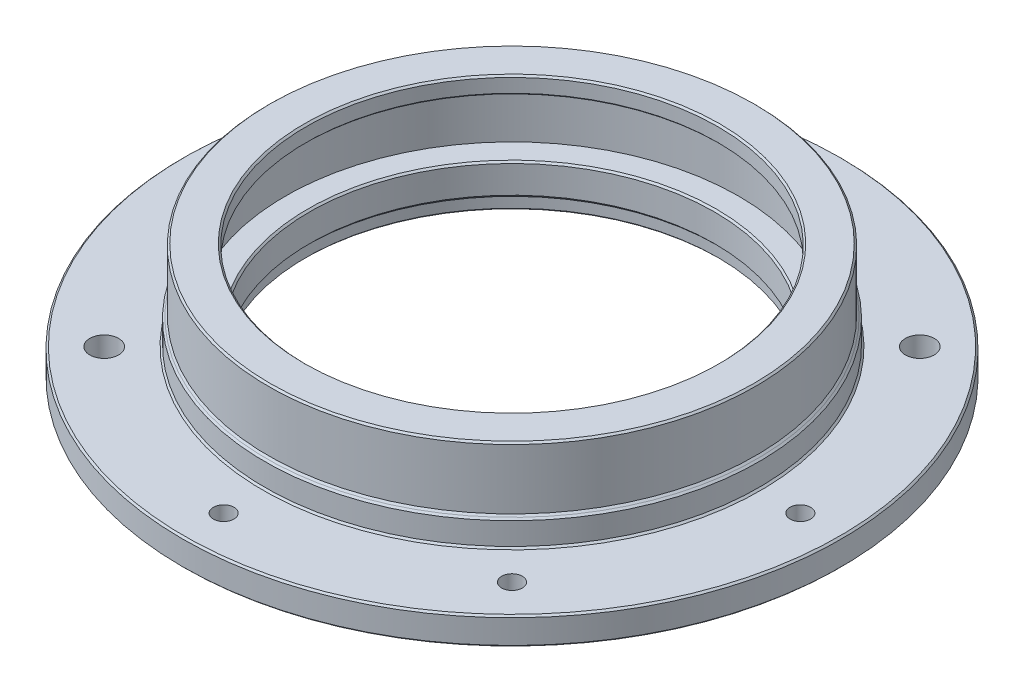
ISO-10303-21;
HEADER;
FILE_DESCRIPTION(('STEP AP214'),'2;1');
FILE_NAME('part.step','',(''),(''),'','','');
FILE_SCHEMA(('AUTOMOTIVE_DESIGN { 1 0 10303 214 1 1 1 1 }'));
ENDSEC;
DATA;
#1=APPLICATION_CONTEXT('core data for automotive mechanical design processes');
#2=APPLICATION_PROTOCOL_DEFINITION('international standard','automotive_design',2000,#1);
#3=PRODUCT_CONTEXT('',#1,'mechanical');
#4=PRODUCT('Part','Part','',(#3));
#5=PRODUCT_RELATED_PRODUCT_CATEGORY('part','',(#4));
#6=PRODUCT_DEFINITION_FORMATION('','',#4);
#7=PRODUCT_DEFINITION_CONTEXT('part definition',#1,'design');
#8=PRODUCT_DEFINITION('design','',#6,#7);
#9=PRODUCT_DEFINITION_SHAPE('','',#8);
#10=(LENGTH_UNIT() NAMED_UNIT(*) SI_UNIT(.MILLI.,.METRE.));
#11=(NAMED_UNIT(*) PLANE_ANGLE_UNIT() SI_UNIT($,.RADIAN.));
#12=(NAMED_UNIT(*) SI_UNIT($,.STERADIAN.) SOLID_ANGLE_UNIT());
#13=UNCERTAINTY_MEASURE_WITH_UNIT(LENGTH_MEASURE(1.E-05),#10,'distance_accuracy_value','');
#14=(GEOMETRIC_REPRESENTATION_CONTEXT(3) GLOBAL_UNCERTAINTY_ASSIGNED_CONTEXT((#13)) GLOBAL_UNIT_ASSIGNED_CONTEXT((#10,
#11,#12)) REPRESENTATION_CONTEXT('',''));
#15=CARTESIAN_POINT('',(0.,0.,0.));
#16=DIRECTION('',(0.,0.,1.));
#17=DIRECTION('',(1.,0.,0.));
#18=AXIS2_PLACEMENT_3D('',#15,#16,#17);
#19=CARTESIAN_POINT('',(-33.25,6.5,0.));
#20=DIRECTION('',(0.,-1.,0.));
#21=DIRECTION('',(0.,0.,-1.));
#22=AXIS2_PLACEMENT_3D('',#19,#20,#21);
#23=PLANE('',#22);
#24=CARTESIAN_POINT('',(0.,6.5,0.));
#25=DIRECTION('',(0.,-1.,0.));
#26=DIRECTION('',(0.,0.,-1.));
#27=AXIS2_PLACEMENT_3D('',#24,#25,#26);
#28=CIRCLE('',#27,29.75);
#29=CARTESIAN_POINT('',(0.,6.5,-29.75));
#30=VERTEX_POINT('',#29);
#31=EDGE_CURVE('E72',#30,#30,#28,.T.);
#32=ORIENTED_EDGE('',*,*,#31,.T.);
#33=EDGE_LOOP('',(#32));
#34=FACE_BOUND('',#33,.T.);
#35=CARTESIAN_POINT('',(0.,6.5,0.));
#36=DIRECTION('',(0.,-1.,0.));
#37=DIRECTION('',(0.,0.,-1.));
#38=AXIS2_PLACEMENT_3D('',#35,#36,#37);
#39=CIRCLE('',#38,33.);
#40=CARTESIAN_POINT('',(0.,6.5,-33.));
#41=VERTEX_POINT('',#40);
#42=EDGE_CURVE('E75',#41,#41,#39,.F.);
#43=ORIENTED_EDGE('',*,*,#42,.T.);
#44=EDGE_LOOP('',(#43));
#45=FACE_BOUND('',#44,.T.);
#46=ADVANCED_FACE('F51',(#34,#45),#23,.F.);
#47=CARTESIAN_POINT('',(0.,0.,0.));
#48=DIRECTION('',(0.,-1.,0.));
#49=DIRECTION('',(0.,0.,-1.));
#50=AXIS2_PLACEMENT_3D('',#47,#48,#49);
#51=CYLINDRICAL_SURFACE('',#50,29.5);
#52=CARTESIAN_POINT('',(0.,2.25000000000002,0.));
#53=DIRECTION('',(0.,1.,0.));
#54=DIRECTION('',(0.,0.,1.));
#55=AXIS2_PLACEMENT_3D('',#52,#53,#54);
#56=CIRCLE('',#55,29.5);
#57=CARTESIAN_POINT('',(0.,2.25000000000002,29.5));
#58=VERTEX_POINT('',#57);
#59=EDGE_CURVE('E78',#58,#58,#56,.F.);
#60=ORIENTED_EDGE('',*,*,#59,.T.);
#61=EDGE_LOOP('',(#60));
#62=FACE_BOUND('',#61,.T.);
#63=CARTESIAN_POINT('',(0.,6.25,0.));
#64=DIRECTION('',(0.,-1.,0.));
#65=DIRECTION('',(0.,0.,-1.));
#66=AXIS2_PLACEMENT_3D('',#63,#64,#65);
#67=CIRCLE('',#66,29.5);
#68=CARTESIAN_POINT('',(0.,6.25,-29.5));
#69=VERTEX_POINT('',#68);
#70=EDGE_CURVE('E81',#69,#69,#67,.F.);
#71=ORIENTED_EDGE('',*,*,#70,.T.);
#72=EDGE_LOOP('',(#71));
#73=FACE_BOUND('',#72,.T.);
#74=ADVANCED_FACE('F115',(#62,#73),#51,.F.);
#75=CARTESIAN_POINT('',(0.,0.,0.));
#76=DIRECTION('',(0.,-1.,0.));
#77=DIRECTION('',(0.,0.,-1.));
#78=AXIS2_PLACEMENT_3D('',#75,#76,#77);
#79=CYLINDRICAL_SURFACE('',#78,30.);
#80=CARTESIAN_POINT('',(0.,1.75000000000002,0.));
#81=DIRECTION('',(0.,1.,0.));
#82=DIRECTION('',(0.,0.,1.));
#83=AXIS2_PLACEMENT_3D('',#80,#81,#82);
#84=CIRCLE('',#83,30.);
#85=CARTESIAN_POINT('',(0.,1.75000000000002,30.));
#86=VERTEX_POINT('',#85);
#87=EDGE_CURVE('E84',#86,#86,#84,.T.);
#88=ORIENTED_EDGE('',*,*,#87,.T.);
#89=EDGE_LOOP('',(#88));
#90=FACE_BOUND('',#89,.T.);
#91=CARTESIAN_POINT('',(0.,0.249999999999983,0.));
#92=DIRECTION('',(0.,1.,0.));
#93=DIRECTION('',(0.,0.,1.));
#94=AXIS2_PLACEMENT_3D('',#91,#92,#93);
#95=CIRCLE('',#94,30.);
#96=CARTESIAN_POINT('',(0.,0.249999999999983,30.));
#97=VERTEX_POINT('',#96);
#98=EDGE_CURVE('E87',#97,#97,#95,.F.);
#99=ORIENTED_EDGE('',*,*,#98,.T.);
#100=EDGE_LOOP('',(#99));
#101=FACE_BOUND('',#100,.T.);
#102=ADVANCED_FACE('F121',(#90,#101),#79,.F.);
#103=CARTESIAN_POINT('',(-30.,0.,0.));
#104=DIRECTION('',(0.,1.,0.));
#105=DIRECTION('',(0.,0.,1.));
#106=AXIS2_PLACEMENT_3D('',#103,#104,#105);
#107=PLANE('',#106);
#108=CARTESIAN_POINT('',(0.,0.,0.));
#109=DIRECTION('',(0.,1.,0.));
#110=DIRECTION('',(0.,0.,1.));
#111=AXIS2_PLACEMENT_3D('',#108,#109,#110);
#112=CIRCLE('',#111,33.);
#113=CARTESIAN_POINT('',(0.,0.,33.));
#114=VERTEX_POINT('',#113);
#115=EDGE_CURVE('E11',#114,#114,#112,.F.);
#116=ORIENTED_EDGE('',*,*,#115,.T.);
#117=EDGE_LOOP('',(#116));
#118=FACE_BOUND('',#117,.T.);
#119=CARTESIAN_POINT('',(0.,0.,0.));
#120=DIRECTION('',(0.,1.,0.));
#121=DIRECTION('',(0.,0.,1.));
#122=AXIS2_PLACEMENT_3D('',#119,#120,#121);
#123=CIRCLE('',#122,30.25);
#124=CARTESIAN_POINT('',(0.,0.,30.25));
#125=VERTEX_POINT('',#124);
#126=EDGE_CURVE('E60',#125,#125,#123,.T.);
#127=ORIENTED_EDGE('',*,*,#126,.T.);
#128=EDGE_LOOP('',(#127));
#129=FACE_BOUND('',#128,.T.);
#130=ADVANCED_FACE('F108',(#118,#129),#107,.F.);
#131=CARTESIAN_POINT('',(0.,0.,0.));
#132=DIRECTION('',(0.,-1.,0.));
#133=DIRECTION('',(0.,0.,-1.));
#134=AXIS2_PLACEMENT_3D('',#131,#132,#133);
#135=CYLINDRICAL_SURFACE('',#134,33.25);
#136=CARTESIAN_POINT('',(0.,6.25,0.));
#137=DIRECTION('',(0.,-1.,0.));
#138=DIRECTION('',(0.,0.,-1.));
#139=AXIS2_PLACEMENT_3D('',#136,#137,#138);
#140=CIRCLE('',#139,33.25);
#141=CARTESIAN_POINT('',(0.,6.25,-33.25));
#142=VERTEX_POINT('',#141);
#143=EDGE_CURVE('E64',#142,#142,#140,.T.);
#144=ORIENTED_EDGE('',*,*,#143,.T.);
#145=EDGE_LOOP('',(#144));
#146=FACE_BOUND('',#145,.T.);
#147=CARTESIAN_POINT('',(0.,0.249999999999993,0.));
#148=DIRECTION('',(0.,1.,0.));
#149=DIRECTION('',(0.,0.,1.));
#150=AXIS2_PLACEMENT_3D('',#147,#148,#149);
#151=CIRCLE('',#150,33.25);
#152=CARTESIAN_POINT('',(0.,0.249999999999993,33.25));
#153=VERTEX_POINT('',#152);
#154=EDGE_CURVE('E69',#153,#153,#151,.T.);
#155=ORIENTED_EDGE('',*,*,#154,.T.);
#156=EDGE_LOOP('',(#155));
#157=FACE_BOUND('',#156,.T.);
#158=ADVANCED_FACE('F98',(#146,#157),#135,.T.);
#159=CARTESIAN_POINT('',(0.,2.25000000000002,0.));
#160=DIRECTION('',(0.,-1.,0.));
#161=DIRECTION('',(0.,0.,-1.));
#162=AXIS2_PLACEMENT_3D('',#159,#160,#161);
#163=CONICAL_SURFACE('',#162,29.5,0.785398163397435);
#164=ORIENTED_EDGE('',*,*,#59,.F.);
#165=EDGE_LOOP('',(#164));
#166=FACE_BOUND('',#165,.T.);
#167=CARTESIAN_POINT('',(0.,2.,0.));
#168=DIRECTION('',(0.,1.,0.));
#169=DIRECTION('',(0.,0.,1.));
#170=AXIS2_PLACEMENT_3D('',#167,#168,#169);
#171=CIRCLE('',#170,29.75);
#172=CARTESIAN_POINT('',(0.,2.,29.75));
#173=VERTEX_POINT('',#172);
#174=EDGE_CURVE('E56',#173,#173,#171,.T.);
#175=ORIENTED_EDGE('',*,*,#174,.F.);
#176=EDGE_LOOP('',(#175));
#177=FACE_BOUND('',#176,.T.);
#178=ADVANCED_FACE('F96',(#166,#177),#163,.F.);
#179=CARTESIAN_POINT('',(0.,2.,0.));
#180=DIRECTION('',(0.,-1.,0.));
#181=DIRECTION('',(0.,0.,-1.));
#182=AXIS2_PLACEMENT_3D('',#179,#180,#181);
#183=CONICAL_SURFACE('',#182,29.75,0.785398163397434);
#184=ORIENTED_EDGE('',*,*,#87,.F.);
#185=EDGE_LOOP('',(#184));
#186=FACE_BOUND('',#185,.T.);
#187=ORIENTED_EDGE('',*,*,#174,.T.);
#188=EDGE_LOOP('',(#187));
#189=FACE_BOUND('',#188,.T.);
#190=ADVANCED_FACE('F94',(#186,#189),#183,.F.);
#191=CARTESIAN_POINT('',(0.,6.5,0.));
#192=DIRECTION('',(0.,1.,0.));
#193=DIRECTION('',(0.,0.,1.));
#194=AXIS2_PLACEMENT_3D('',#191,#192,#193);
#195=CONICAL_SURFACE('',#194,29.75,0.785398163397448);
#196=ORIENTED_EDGE('',*,*,#70,.F.);
#197=EDGE_LOOP('',(#196));
#198=FACE_BOUND('',#197,.T.);
#199=ORIENTED_EDGE('',*,*,#31,.F.);
#200=EDGE_LOOP('',(#199));
#201=FACE_BOUND('',#200,.T.);
#202=ADVANCED_FACE('F105',(#198,#201),#195,.F.);
#203=CARTESIAN_POINT('',(0.,6.25,0.));
#204=DIRECTION('',(0.,-1.,0.));
#205=DIRECTION('',(0.,0.,-1.));
#206=AXIS2_PLACEMENT_3D('',#203,#204,#205);
#207=CONICAL_SURFACE('',#206,33.25,0.785398163397448);
#208=ORIENTED_EDGE('',*,*,#42,.F.);
#209=EDGE_LOOP('',(#208));
#210=FACE_BOUND('',#209,.T.);
#211=ORIENTED_EDGE('',*,*,#143,.F.);
#212=EDGE_LOOP('',(#211));
#213=FACE_BOUND('',#212,.T.);
#214=ADVANCED_FACE('F139',(#210,#213),#207,.T.);
#215=CARTESIAN_POINT('',(0.,0.,0.));
#216=DIRECTION('',(0.,1.,0.));
#217=DIRECTION('',(0.,0.,1.));
#218=AXIS2_PLACEMENT_3D('',#215,#216,#217);
#219=CONICAL_SURFACE('',#218,33.,0.785398163397462);
#220=ORIENTED_EDGE('',*,*,#154,.F.);
#221=EDGE_LOOP('',(#220));
#222=FACE_BOUND('',#221,.T.);
#223=ORIENTED_EDGE('',*,*,#115,.F.);
#224=EDGE_LOOP('',(#223));
#225=FACE_BOUND('',#224,.T.);
#226=ADVANCED_FACE('F142',(#222,#225),#219,.T.);
#227=CARTESIAN_POINT('',(0.,0.249999999999983,0.));
#228=DIRECTION('',(0.,-1.,0.));
#229=DIRECTION('',(0.,0.,-1.));
#230=AXIS2_PLACEMENT_3D('',#227,#228,#229);
#231=CONICAL_SURFACE('',#230,30.,0.785398163397434);
#232=ORIENTED_EDGE('',*,*,#126,.F.);
#233=EDGE_LOOP('',(#232));
#234=FACE_BOUND('',#233,.T.);
#235=ORIENTED_EDGE('',*,*,#98,.F.);
#236=EDGE_LOOP('',(#235));
#237=FACE_BOUND('',#236,.T.);
#238=ADVANCED_FACE('F54',(#234,#237),#231,.F.);
#239=CLOSED_SHELL('',(#46,#74,#102,#130,#158,#178,#190,#202,#214,#226,#238));
#240=MANIFOLD_SOLID_BREP('B2',#239);
#241=CARTESIAN_POINT('',(0.,0.,0.));
#242=DIRECTION('',(0.,-1.,0.));
#243=DIRECTION('',(0.,0.,-1.));
#244=AXIS2_PLACEMENT_3D('',#241,#242,#243);
#245=CYLINDRICAL_SURFACE('',#244,48.);
#246=CARTESIAN_POINT('',(0.,3.74999999999999,0.));
#247=DIRECTION('',(0.,-1.,0.));
#248=DIRECTION('',(0.,0.,-1.));
#249=AXIS2_PLACEMENT_3D('',#246,#247,#248);
#250=CIRCLE('',#249,48.);
#251=CARTESIAN_POINT('',(0.,3.74999999999999,-48.));
#252=VERTEX_POINT('',#251);
#253=EDGE_CURVE('E232',#252,#252,#250,.T.);
#254=ORIENTED_EDGE('',*,*,#253,.T.);
#255=EDGE_LOOP('',(#254));
#256=FACE_BOUND('',#255,.T.);
#257=CARTESIAN_POINT('',(0.,0.249999999999966,0.));
#258=DIRECTION('',(0.,1.,0.));
#259=DIRECTION('',(0.,0.,1.));
#260=AXIS2_PLACEMENT_3D('',#257,#258,#259);
#261=CIRCLE('',#260,48.);
#262=CARTESIAN_POINT('',(0.,0.249999999999966,48.));
#263=VERTEX_POINT('',#262);
#264=EDGE_CURVE('E235',#263,#263,#261,.T.);
#265=ORIENTED_EDGE('',*,*,#264,.T.);
#266=EDGE_LOOP('',(#265));
#267=FACE_BOUND('',#266,.T.);
#268=ADVANCED_FACE('F214',(#256,#267),#245,.T.);
#269=CARTESIAN_POINT('',(-48.,0.,0.));
#270=DIRECTION('',(0.,1.,0.));
#271=DIRECTION('',(0.,0.,1.));
#272=AXIS2_PLACEMENT_3D('',#269,#270,#271);
#273=PLANE('',#272);
#274=CARTESIAN_POINT('',(0.,0.,0.));
#275=DIRECTION('',(0.,1.,0.));
#276=DIRECTION('',(0.,0.,1.));
#277=AXIS2_PLACEMENT_3D('',#274,#275,#276);
#278=CIRCLE('',#277,47.75);
#279=CARTESIAN_POINT('',(0.,0.,47.75));
#280=VERTEX_POINT('',#279);
#281=EDGE_CURVE('E223',#280,#280,#278,.F.);
#282=ORIENTED_EDGE('',*,*,#281,.T.);
#283=EDGE_LOOP('',(#282));
#284=FACE_BOUND('',#283,.T.);
#285=CARTESIAN_POINT('',(0.,0.,0.));
#286=DIRECTION('',(0.,1.,0.));
#287=DIRECTION('',(0.,0.,1.));
#288=AXIS2_PLACEMENT_3D('',#285,#286,#287);
#289=CIRCLE('',#288,33.5);
#290=CARTESIAN_POINT('',(0.,0.,33.5));
#291=VERTEX_POINT('',#290);
#292=EDGE_CURVE('E227',#291,#291,#289,.T.);
#293=ORIENTED_EDGE('',*,*,#292,.T.);
#294=EDGE_LOOP('',(#293));
#295=FACE_BOUND('',#294,.T.);
#296=CARTESIAN_POINT('',(-42.,0.,0.));
#297=DIRECTION('',(0.,1.,0.));
#298=DIRECTION('',(0.,0.,1.));
#299=AXIS2_PLACEMENT_3D('',#296,#297,#298);
#300=CIRCLE('',#299,1.5);
#301=CARTESIAN_POINT('',(-42.,0.,1.5));
#302=VERTEX_POINT('',#301);
#303=EDGE_CURVE('E280',#302,#302,#300,.T.);
#304=ORIENTED_EDGE('',*,*,#303,.T.);
#305=EDGE_LOOP('',(#304));
#306=FACE_BOUND('',#305,.T.);
#307=CARTESIAN_POINT('',(0.,0.,42.));
#308=DIRECTION('',(0.,1.,0.));
#309=DIRECTION('',(0.,0.,1.));
#310=AXIS2_PLACEMENT_3D('',#307,#308,#309);
#311=CIRCLE('',#310,1.5);
#312=CARTESIAN_POINT('',(0.,0.,43.5));
#313=VERTEX_POINT('',#312);
#314=EDGE_CURVE('E310',#313,#313,#311,.T.);
#315=ORIENTED_EDGE('',*,*,#314,.T.);
#316=EDGE_LOOP('',(#315));
#317=FACE_BOUND('',#316,.T.);
#318=CARTESIAN_POINT('',(29.6984848098347,0.,29.6984848098353));
#319=DIRECTION('',(0.,1.,0.));
#320=DIRECTION('',(0.,0.,1.));
#321=AXIS2_PLACEMENT_3D('',#318,#319,#320);
#322=CIRCLE('',#321,1.5);
#323=CARTESIAN_POINT('',(29.6984848098347,0.,31.1984848098353));
#324=VERTEX_POINT('',#323);
#325=EDGE_CURVE('E316',#324,#324,#322,.T.);
#326=ORIENTED_EDGE('',*,*,#325,.T.);
#327=EDGE_LOOP('',(#326));
#328=FACE_BOUND('',#327,.T.);
#329=CARTESIAN_POINT('',(42.,0.,2.93284432462823E-13));
#330=DIRECTION('',(0.,1.,0.));
#331=DIRECTION('',(0.,0.,1.));
#332=AXIS2_PLACEMENT_3D('',#329,#330,#331);
#333=CIRCLE('',#332,1.5);
#334=CARTESIAN_POINT('',(42.,0.,1.5000000000003));
#335=VERTEX_POINT('',#334);
#336=EDGE_CURVE('E285',#335,#335,#333,.T.);
#337=ORIENTED_EDGE('',*,*,#336,.T.);
#338=EDGE_LOOP('',(#337));
#339=FACE_BOUND('',#338,.T.);
#340=CARTESIAN_POINT('',(29.6984848098351,0.,-29.6984848098344));
#341=DIRECTION('',(0.,1.,0.));
#342=DIRECTION('',(0.,0.,-1.));
#343=AXIS2_PLACEMENT_3D('',#340,#341,#342);
#344=CIRCLE('',#343,2.09999999999999);
#345=CARTESIAN_POINT('',(29.6984848098351,0.,-31.7984848098344));
#346=VERTEX_POINT('',#345);
#347=EDGE_CURVE('E284',#346,#346,#344,.T.);
#348=ORIENTED_EDGE('',*,*,#347,.T.);
#349=EDGE_LOOP('',(#348));
#350=FACE_BOUND('',#349,.T.);
#351=CARTESIAN_POINT('',(1.46642216231412E-13,0.,-42.));
#352=DIRECTION('',(0.,1.,0.));
#353=DIRECTION('',(0.,0.,1.));
#354=AXIS2_PLACEMENT_3D('',#351,#352,#353);
#355=CIRCLE('',#354,1.5);
#356=CARTESIAN_POINT('',(1.46642216231412E-13,0.,-40.5));
#357=VERTEX_POINT('',#356);
#358=EDGE_CURVE('E291',#357,#357,#355,.T.);
#359=ORIENTED_EDGE('',*,*,#358,.T.);
#360=EDGE_LOOP('',(#359));
#361=FACE_BOUND('',#360,.T.);
#362=CARTESIAN_POINT('',(-29.698484809835,0.,-29.6984848098351));
#363=DIRECTION('',(0.,1.,0.));
#364=DIRECTION('',(0.,0.,1.));
#365=AXIS2_PLACEMENT_3D('',#362,#363,#364);
#366=CIRCLE('',#365,1.5);
#367=CARTESIAN_POINT('',(-29.698484809835,0.,-28.198484809835));
#368=VERTEX_POINT('',#367);
#369=EDGE_CURVE('E297',#368,#368,#366,.T.);
#370=ORIENTED_EDGE('',*,*,#369,.T.);
#371=EDGE_LOOP('',(#370));
#372=FACE_BOUND('',#371,.T.);
#373=CARTESIAN_POINT('',(-29.6984848098346,0.,29.6984848098354));
#374=DIRECTION('',(0.,1.,0.));
#375=DIRECTION('',(0.,0.,1.));
#376=AXIS2_PLACEMENT_3D('',#373,#374,#375);
#377=CIRCLE('',#376,2.0999999999998);
#378=CARTESIAN_POINT('',(-29.6984848098346,0.,31.7984848098352));
#379=VERTEX_POINT('',#378);
#380=EDGE_CURVE('E303',#379,#379,#377,.T.);
#381=ORIENTED_EDGE('',*,*,#380,.T.);
#382=EDGE_LOOP('',(#381));
#383=FACE_BOUND('',#382,.T.);
#384=ADVANCED_FACE('F329',(#284,#295,#306,#317,#328,#339,#350,#361,#372,#383),#273,.F.);
#385=CARTESIAN_POINT('',(0.,0.,0.));
#386=DIRECTION('',(0.,-1.,0.));
#387=DIRECTION('',(0.,0.,-1.));
#388=AXIS2_PLACEMENT_3D('',#385,#386,#387);
#389=CYLINDRICAL_SURFACE('',#388,33.25);
#390=CARTESIAN_POINT('',(0.,0.249999999999993,0.));
#391=DIRECTION('',(0.,1.,0.));
#392=DIRECTION('',(0.,0.,1.));
#393=AXIS2_PLACEMENT_3D('',#390,#391,#392);
#394=CIRCLE('',#393,33.25);
#395=CARTESIAN_POINT('',(0.,0.249999999999993,33.25));
#396=VERTEX_POINT('',#395);
#397=EDGE_CURVE('E50',#396,#396,#394,.F.);
#398=ORIENTED_EDGE('',*,*,#397,.T.);
#399=EDGE_LOOP('',(#398));
#400=FACE_BOUND('',#399,.T.);
#401=CARTESIAN_POINT('',(0.,6.5,0.));
#402=DIRECTION('',(0.,-1.,0.));
#403=DIRECTION('',(0.,0.,-1.));
#404=AXIS2_PLACEMENT_3D('',#401,#402,#403);
#405=CIRCLE('',#404,33.25);
#406=CARTESIAN_POINT('',(0.,6.5,-33.25));
#407=VERTEX_POINT('',#406);
#408=EDGE_CURVE('E271',#407,#407,#405,.T.);
#409=ORIENTED_EDGE('',*,*,#408,.F.);
#410=EDGE_LOOP('',(#409));
#411=FACE_BOUND('',#410,.T.);
#412=ADVANCED_FACE('F382',(#400,#411),#389,.F.);
#413=CARTESIAN_POINT('',(-33.25,6.5,0.));
#414=DIRECTION('',(0.,1.,0.));
#415=DIRECTION('',(0.,0.,1.));
#416=AXIS2_PLACEMENT_3D('',#413,#414,#415);
#417=PLANE('',#416);
#418=CARTESIAN_POINT('',(0.,6.5,0.));
#419=DIRECTION('',(0.,-1.,0.));
#420=DIRECTION('',(0.,0.,-1.));
#421=AXIS2_PLACEMENT_3D('',#418,#419,#420);
#422=CIRCLE('',#421,33.);
#423=CARTESIAN_POINT('',(0.,6.5,-33.));
#424=VERTEX_POINT('',#423);
#425=EDGE_CURVE('E274',#424,#424,#422,.T.);
#426=ORIENTED_EDGE('',*,*,#425,.F.);
#427=EDGE_LOOP('',(#426));
#428=FACE_BOUND('',#427,.T.);
#429=ORIENTED_EDGE('',*,*,#408,.T.);
#430=EDGE_LOOP('',(#429));
#431=FACE_BOUND('',#430,.T.);
#432=ADVANCED_FACE('F593',(#428,#431),#417,.F.);
#433=CARTESIAN_POINT('',(0.,0.,0.));
#434=DIRECTION('',(0.,-1.,0.));
#435=DIRECTION('',(0.,0.,-1.));
#436=AXIS2_PLACEMENT_3D('',#433,#434,#435);
#437=CYLINDRICAL_SURFACE('',#436,33.);
#438=CARTESIAN_POINT('',(0.,14.5,0.));
#439=DIRECTION('',(0.,-1.,0.));
#440=DIRECTION('',(0.,0.,-1.));
#441=AXIS2_PLACEMENT_3D('',#438,#439,#440);
#442=CIRCLE('',#441,33.);
#443=CARTESIAN_POINT('',(0.,14.5,-33.));
#444=VERTEX_POINT('',#443);
#445=EDGE_CURVE('E277',#444,#444,#442,.T.);
#446=ORIENTED_EDGE('',*,*,#445,.F.);
#447=EDGE_LOOP('',(#446));
#448=FACE_BOUND('',#447,.T.);
#449=ORIENTED_EDGE('',*,*,#425,.T.);
#450=EDGE_LOOP('',(#449));
#451=FACE_BOUND('',#450,.T.);
#452=ADVANCED_FACE('F585',(#448,#451),#437,.F.);
#453=CARTESIAN_POINT('',(-33.,14.5,0.));
#454=DIRECTION('',(0.,1.,0.));
#455=DIRECTION('',(0.,0.,1.));
#456=AXIS2_PLACEMENT_3D('',#453,#454,#455);
#457=PLANE('',#456);
#458=CARTESIAN_POINT('',(0.,14.5,0.));
#459=DIRECTION('',(0.,1.,0.));
#460=DIRECTION('',(0.,0.,1.));
#461=AXIS2_PLACEMENT_3D('',#458,#459,#460);
#462=CIRCLE('',#461,30.25);
#463=CARTESIAN_POINT('',(0.,14.5,30.25));
#464=VERTEX_POINT('',#463);
#465=EDGE_CURVE('E250',#464,#464,#462,.T.);
#466=ORIENTED_EDGE('',*,*,#465,.T.);
#467=EDGE_LOOP('',(#466));
#468=FACE_BOUND('',#467,.T.);
#469=ORIENTED_EDGE('',*,*,#445,.T.);
#470=EDGE_LOOP('',(#469));
#471=FACE_BOUND('',#470,.T.);
#472=ADVANCED_FACE('F577',(#468,#471),#457,.F.);
#473=CARTESIAN_POINT('',(0.,0.,0.));
#474=DIRECTION('',(0.,-1.,0.));
#475=DIRECTION('',(0.,0.,-1.));
#476=AXIS2_PLACEMENT_3D('',#473,#474,#475);
#477=CYLINDRICAL_SURFACE('',#476,30.);
#478=CARTESIAN_POINT('',(0.,14.75,0.));
#479=DIRECTION('',(0.,1.,0.));
#480=DIRECTION('',(0.,0.,1.));
#481=AXIS2_PLACEMENT_3D('',#478,#479,#480);
#482=CIRCLE('',#481,30.);
#483=CARTESIAN_POINT('',(0.,14.75,30.));
#484=VERTEX_POINT('',#483);
#485=EDGE_CURVE('E253',#484,#484,#482,.F.);
#486=ORIENTED_EDGE('',*,*,#485,.T.);
#487=EDGE_LOOP('',(#486));
#488=FACE_BOUND('',#487,.T.);
#489=CARTESIAN_POINT('',(0.,16.75,0.));
#490=DIRECTION('',(0.,-1.,0.));
#491=DIRECTION('',(0.,0.,-1.));
#492=AXIS2_PLACEMENT_3D('',#489,#490,#491);
#493=CIRCLE('',#492,30.);
#494=CARTESIAN_POINT('',(0.,16.75,-30.));
#495=VERTEX_POINT('',#494);
#496=EDGE_CURVE('E256',#495,#495,#493,.F.);
#497=ORIENTED_EDGE('',*,*,#496,.T.);
#498=EDGE_LOOP('',(#497));
#499=FACE_BOUND('',#498,.T.);
#500=ADVANCED_FACE('F569',(#488,#499),#477,.F.);
#501=CARTESIAN_POINT('',(-30.,17.,0.));
#502=DIRECTION('',(0.,-1.,0.));
#503=DIRECTION('',(0.,0.,-1.));
#504=AXIS2_PLACEMENT_3D('',#501,#502,#503);
#505=PLANE('',#504);
#506=CARTESIAN_POINT('',(0.,17.,0.));
#507=DIRECTION('',(0.,-1.,0.));
#508=DIRECTION('',(0.,0.,-1.));
#509=AXIS2_PLACEMENT_3D('',#506,#507,#508);
#510=CIRCLE('',#509,35.25);
#511=CARTESIAN_POINT('',(0.,17.,-35.25));
#512=VERTEX_POINT('',#511);
#513=EDGE_CURVE('E259',#512,#512,#510,.F.);
#514=ORIENTED_EDGE('',*,*,#513,.T.);
#515=EDGE_LOOP('',(#514));
#516=FACE_BOUND('',#515,.T.);
#517=CARTESIAN_POINT('',(0.,17.,0.));
#518=DIRECTION('',(0.,-1.,0.));
#519=DIRECTION('',(0.,0.,-1.));
#520=AXIS2_PLACEMENT_3D('',#517,#518,#519);
#521=CIRCLE('',#520,30.25);
#522=CARTESIAN_POINT('',(0.,17.,-30.25));
#523=VERTEX_POINT('',#522);
#524=EDGE_CURVE('E262',#523,#523,#521,.T.);
#525=ORIENTED_EDGE('',*,*,#524,.T.);
#526=EDGE_LOOP('',(#525));
#527=FACE_BOUND('',#526,.T.);
#528=ADVANCED_FACE('F561',(#516,#527),#505,.F.);
#529=CARTESIAN_POINT('',(0.,0.,0.));
#530=DIRECTION('',(0.,-1.,0.));
#531=DIRECTION('',(0.,0.,-1.));
#532=AXIS2_PLACEMENT_3D('',#529,#530,#531);
#533=CYLINDRICAL_SURFACE('',#532,35.5);
#534=CARTESIAN_POINT('',(0.,16.75,0.));
#535=DIRECTION('',(0.,-1.,0.));
#536=DIRECTION('',(0.,0.,-1.));
#537=AXIS2_PLACEMENT_3D('',#534,#535,#536);
#538=CIRCLE('',#537,35.5);
#539=CARTESIAN_POINT('',(0.,16.75,-35.5));
#540=VERTEX_POINT('',#539);
#541=EDGE_CURVE('E265',#540,#540,#538,.T.);
#542=ORIENTED_EDGE('',*,*,#541,.T.);
#543=EDGE_LOOP('',(#542));
#544=FACE_BOUND('',#543,.T.);
#545=CARTESIAN_POINT('',(0.,8.,0.));
#546=DIRECTION('',(0.,-1.,0.));
#547=DIRECTION('',(0.,0.,-1.));
#548=AXIS2_PLACEMENT_3D('',#545,#546,#547);
#549=CIRCLE('',#548,35.5);
#550=CARTESIAN_POINT('',(0.,8.,-35.5));
#551=VERTEX_POINT('',#550);
#552=EDGE_CURVE('E268',#551,#551,#549,.F.);
#553=ORIENTED_EDGE('',*,*,#552,.T.);
#554=EDGE_LOOP('',(#553));
#555=FACE_BOUND('',#554,.T.);
#556=ADVANCED_FACE('F553',(#544,#555),#533,.T.);
#557=CARTESIAN_POINT('',(0.,0.,0.));
#558=DIRECTION('',(0.,-1.,0.));
#559=DIRECTION('',(0.,0.,-1.));
#560=AXIS2_PLACEMENT_3D('',#557,#558,#559);
#561=CYLINDRICAL_SURFACE('',#560,36.);
#562=CARTESIAN_POINT('',(0.,7.49999999999997,0.));
#563=DIRECTION('',(0.,-1.,0.));
#564=DIRECTION('',(0.,0.,-1.));
#565=AXIS2_PLACEMENT_3D('',#562,#563,#564);
#566=CIRCLE('',#565,36.);
#567=CARTESIAN_POINT('',(0.,7.49999999999997,-36.));
#568=VERTEX_POINT('',#567);
#569=EDGE_CURVE('E244',#568,#568,#566,.T.);
#570=ORIENTED_EDGE('',*,*,#569,.T.);
#571=EDGE_LOOP('',(#570));
#572=FACE_BOUND('',#571,.T.);
#573=CARTESIAN_POINT('',(0.,4.24999999999998,0.));
#574=DIRECTION('',(0.,-1.,0.));
#575=DIRECTION('',(0.,0.,-1.));
#576=AXIS2_PLACEMENT_3D('',#573,#574,#575);
#577=CIRCLE('',#576,36.);
#578=CARTESIAN_POINT('',(0.,4.24999999999998,-36.));
#579=VERTEX_POINT('',#578);
#580=EDGE_CURVE('E247',#579,#579,#577,.F.);
#581=ORIENTED_EDGE('',*,*,#580,.T.);
#582=EDGE_LOOP('',(#581));
#583=FACE_BOUND('',#582,.T.);
#584=ADVANCED_FACE('F344',(#572,#583),#561,.T.);
#585=CARTESIAN_POINT('',(-36.,4.,0.));
#586=DIRECTION('',(0.,-1.,0.));
#587=DIRECTION('',(0.,0.,-1.));
#588=AXIS2_PLACEMENT_3D('',#585,#586,#587);
#589=PLANE('',#588);
#590=CARTESIAN_POINT('',(0.,4.,0.));
#591=DIRECTION('',(0.,-1.,0.));
#592=DIRECTION('',(0.,0.,-1.));
#593=AXIS2_PLACEMENT_3D('',#590,#591,#592);
#594=CIRCLE('',#593,36.25);
#595=CARTESIAN_POINT('',(0.,4.,-36.25));
#596=VERTEX_POINT('',#595);
#597=EDGE_CURVE('E238',#596,#596,#594,.T.);
#598=ORIENTED_EDGE('',*,*,#597,.T.);
#599=EDGE_LOOP('',(#598));
#600=FACE_BOUND('',#599,.T.);
#601=CARTESIAN_POINT('',(0.,4.,0.));
#602=DIRECTION('',(0.,-1.,0.));
#603=DIRECTION('',(0.,0.,-1.));
#604=AXIS2_PLACEMENT_3D('',#601,#602,#603);
#605=CIRCLE('',#604,47.75);
#606=CARTESIAN_POINT('',(0.,4.,-47.75));
#607=VERTEX_POINT('',#606);
#608=EDGE_CURVE('E241',#607,#607,#605,.F.);
#609=ORIENTED_EDGE('',*,*,#608,.T.);
#610=EDGE_LOOP('',(#609));
#611=FACE_BOUND('',#610,.T.);
#612=CARTESIAN_POINT('',(-42.,4.,0.));
#613=DIRECTION('',(0.,1.,0.));
#614=DIRECTION('',(0.,0.,1.));
#615=AXIS2_PLACEMENT_3D('',#612,#613,#614);
#616=CIRCLE('',#615,1.5);
#617=CARTESIAN_POINT('',(-42.,4.,1.5));
#618=VERTEX_POINT('',#617);
#619=EDGE_CURVE('E306',#618,#618,#616,.T.);
#620=ORIENTED_EDGE('',*,*,#619,.F.);
#621=EDGE_LOOP('',(#620));
#622=FACE_BOUND('',#621,.T.);
#623=CARTESIAN_POINT('',(0.,4.,42.));
#624=DIRECTION('',(0.,1.,0.));
#625=DIRECTION('',(0.,0.,1.));
#626=AXIS2_PLACEMENT_3D('',#623,#624,#625);
#627=CIRCLE('',#626,1.5);
#628=CARTESIAN_POINT('',(0.,4.,43.5));
#629=VERTEX_POINT('',#628);
#630=EDGE_CURVE('E307',#629,#629,#627,.T.);
#631=ORIENTED_EDGE('',*,*,#630,.F.);
#632=EDGE_LOOP('',(#631));
#633=FACE_BOUND('',#632,.T.);
#634=CARTESIAN_POINT('',(29.6984848098347,4.,29.6984848098353));
#635=DIRECTION('',(0.,1.,0.));
#636=DIRECTION('',(0.,0.,1.));
#637=AXIS2_PLACEMENT_3D('',#634,#635,#636);
#638=CIRCLE('',#637,1.5);
#639=CARTESIAN_POINT('',(29.6984848098347,4.,31.1984848098353));
#640=VERTEX_POINT('',#639);
#641=EDGE_CURVE('E313',#640,#640,#638,.T.);
#642=ORIENTED_EDGE('',*,*,#641,.F.);
#643=EDGE_LOOP('',(#642));
#644=FACE_BOUND('',#643,.T.);
#645=CARTESIAN_POINT('',(42.,4.,2.93284432462823E-13));
#646=DIRECTION('',(0.,1.,0.));
#647=DIRECTION('',(0.,0.,1.));
#648=AXIS2_PLACEMENT_3D('',#645,#646,#647);
#649=CIRCLE('',#648,1.5);
#650=CARTESIAN_POINT('',(42.,4.,1.5000000000003));
#651=VERTEX_POINT('',#650);
#652=EDGE_CURVE('E319',#651,#651,#649,.T.);
#653=ORIENTED_EDGE('',*,*,#652,.F.);
#654=EDGE_LOOP('',(#653));
#655=FACE_BOUND('',#654,.T.);
#656=CARTESIAN_POINT('',(29.6984848098351,4.,-29.6984848098344));
#657=DIRECTION('',(0.,1.,0.));
#658=DIRECTION('',(0.,0.,-1.));
#659=AXIS2_PLACEMENT_3D('',#656,#657,#658);
#660=CIRCLE('',#659,2.09999999999999);
#661=CARTESIAN_POINT('',(29.6984848098351,4.,-31.7984848098344));
#662=VERTEX_POINT('',#661);
#663=EDGE_CURVE('E281',#662,#662,#660,.T.);
#664=ORIENTED_EDGE('',*,*,#663,.F.);
#665=EDGE_LOOP('',(#664));
#666=FACE_BOUND('',#665,.T.);
#667=CARTESIAN_POINT('',(1.46642216231412E-13,4.,-42.));
#668=DIRECTION('',(0.,1.,0.));
#669=DIRECTION('',(0.,0.,1.));
#670=AXIS2_PLACEMENT_3D('',#667,#668,#669);
#671=CIRCLE('',#670,1.5);
#672=CARTESIAN_POINT('',(1.46642216231412E-13,4.,-40.5));
#673=VERTEX_POINT('',#672);
#674=EDGE_CURVE('E288',#673,#673,#671,.T.);
#675=ORIENTED_EDGE('',*,*,#674,.F.);
#676=EDGE_LOOP('',(#675));
#677=FACE_BOUND('',#676,.T.);
#678=CARTESIAN_POINT('',(-29.698484809835,4.,-29.6984848098351));
#679=DIRECTION('',(0.,1.,0.));
#680=DIRECTION('',(0.,0.,1.));
#681=AXIS2_PLACEMENT_3D('',#678,#679,#680);
#682=CIRCLE('',#681,1.5);
#683=CARTESIAN_POINT('',(-29.698484809835,4.,-28.198484809835));
#684=VERTEX_POINT('',#683);
#685=EDGE_CURVE('E294',#684,#684,#682,.T.);
#686=ORIENTED_EDGE('',*,*,#685,.F.);
#687=EDGE_LOOP('',(#686));
#688=FACE_BOUND('',#687,.T.);
#689=CARTESIAN_POINT('',(-29.6984848098346,4.,29.6984848098354));
#690=DIRECTION('',(0.,1.,0.));
#691=DIRECTION('',(0.,0.,1.));
#692=AXIS2_PLACEMENT_3D('',#689,#690,#691);
#693=CIRCLE('',#692,2.0999999999998);
#694=CARTESIAN_POINT('',(-29.6984848098346,4.,31.7984848098352));
#695=VERTEX_POINT('',#694);
#696=EDGE_CURVE('E300',#695,#695,#693,.T.);
#697=ORIENTED_EDGE('',*,*,#696,.F.);
#698=EDGE_LOOP('',(#697));
#699=FACE_BOUND('',#698,.T.);
#700=ADVANCED_FACE('F340',(#600,#611,#622,#633,#644,#655,#666,#677,#688,#699),#589,.F.);
#701=CARTESIAN_POINT('',(-29.6984848098346,0.,29.6984848098354));
#702=DIRECTION('',(0.,1.,0.));
#703=DIRECTION('',(0.,0.,1.));
#704=AXIS2_PLACEMENT_3D('',#701,#702,#703);
#705=CYLINDRICAL_SURFACE('',#704,2.0999999999998);
#706=ORIENTED_EDGE('',*,*,#380,.F.);
#707=EDGE_LOOP('',(#706));
#708=FACE_BOUND('',#707,.T.);
#709=ORIENTED_EDGE('',*,*,#696,.T.);
#710=EDGE_LOOP('',(#709));
#711=FACE_BOUND('',#710,.T.);
#712=ADVANCED_FACE('F343',(#708,#711),#705,.F.);
#713=CARTESIAN_POINT('',(-29.698484809835,0.,-29.6984848098351));
#714=DIRECTION('',(0.,1.,0.));
#715=DIRECTION('',(0.,0.,1.));
#716=AXIS2_PLACEMENT_3D('',#713,#714,#715);
#717=CYLINDRICAL_SURFACE('',#716,1.5);
#718=ORIENTED_EDGE('',*,*,#369,.F.);
#719=EDGE_LOOP('',(#718));
#720=FACE_BOUND('',#719,.T.);
#721=ORIENTED_EDGE('',*,*,#685,.T.);
#722=EDGE_LOOP('',(#721));
#723=FACE_BOUND('',#722,.T.);
#724=ADVANCED_FACE('F362',(#720,#723),#717,.F.);
#725=CARTESIAN_POINT('',(1.46642216231412E-13,0.,-42.));
#726=DIRECTION('',(0.,1.,0.));
#727=DIRECTION('',(0.,0.,1.));
#728=AXIS2_PLACEMENT_3D('',#725,#726,#727);
#729=CYLINDRICAL_SURFACE('',#728,1.5);
#730=ORIENTED_EDGE('',*,*,#358,.F.);
#731=EDGE_LOOP('',(#730));
#732=FACE_BOUND('',#731,.T.);
#733=ORIENTED_EDGE('',*,*,#674,.T.);
#734=EDGE_LOOP('',(#733));
#735=FACE_BOUND('',#734,.T.);
#736=ADVANCED_FACE('F370',(#732,#735),#729,.F.);
#737=CARTESIAN_POINT('',(29.6984848098351,0.,-29.6984848098344));
#738=DIRECTION('',(0.,1.,0.));
#739=DIRECTION('',(0.,0.,1.));
#740=AXIS2_PLACEMENT_3D('',#737,#738,#739);
#741=CYLINDRICAL_SURFACE('',#740,2.09999999999999);
#742=ORIENTED_EDGE('',*,*,#347,.F.);
#743=EDGE_LOOP('',(#742));
#744=FACE_BOUND('',#743,.T.);
#745=ORIENTED_EDGE('',*,*,#663,.T.);
#746=EDGE_LOOP('',(#745));
#747=FACE_BOUND('',#746,.T.);
#748=ADVANCED_FACE('F516',(#744,#747),#741,.F.);
#749=CARTESIAN_POINT('',(42.,0.,2.93284432462823E-13));
#750=DIRECTION('',(0.,1.,0.));
#751=DIRECTION('',(0.,0.,1.));
#752=AXIS2_PLACEMENT_3D('',#749,#750,#751);
#753=CYLINDRICAL_SURFACE('',#752,1.5);
#754=ORIENTED_EDGE('',*,*,#336,.F.);
#755=EDGE_LOOP('',(#754));
#756=FACE_BOUND('',#755,.T.);
#757=ORIENTED_EDGE('',*,*,#652,.T.);
#758=EDGE_LOOP('',(#757));
#759=FACE_BOUND('',#758,.T.);
#760=ADVANCED_FACE('F506',(#756,#759),#753,.F.);
#761=CARTESIAN_POINT('',(29.6984848098347,0.,29.6984848098353));
#762=DIRECTION('',(0.,1.,0.));
#763=DIRECTION('',(0.,0.,1.));
#764=AXIS2_PLACEMENT_3D('',#761,#762,#763);
#765=CYLINDRICAL_SURFACE('',#764,1.5);
#766=ORIENTED_EDGE('',*,*,#325,.F.);
#767=EDGE_LOOP('',(#766));
#768=FACE_BOUND('',#767,.T.);
#769=ORIENTED_EDGE('',*,*,#641,.T.);
#770=EDGE_LOOP('',(#769));
#771=FACE_BOUND('',#770,.T.);
#772=ADVANCED_FACE('F497',(#768,#771),#765,.F.);
#773=CARTESIAN_POINT('',(0.,0.,42.));
#774=DIRECTION('',(0.,1.,0.));
#775=DIRECTION('',(0.,0.,1.));
#776=AXIS2_PLACEMENT_3D('',#773,#774,#775);
#777=CYLINDRICAL_SURFACE('',#776,1.5);
#778=ORIENTED_EDGE('',*,*,#314,.F.);
#779=EDGE_LOOP('',(#778));
#780=FACE_BOUND('',#779,.T.);
#781=ORIENTED_EDGE('',*,*,#630,.T.);
#782=EDGE_LOOP('',(#781));
#783=FACE_BOUND('',#782,.T.);
#784=ADVANCED_FACE('F336',(#780,#783),#777,.F.);
#785=CARTESIAN_POINT('',(-42.,0.,0.));
#786=DIRECTION('',(0.,1.,0.));
#787=DIRECTION('',(0.,0.,1.));
#788=AXIS2_PLACEMENT_3D('',#785,#786,#787);
#789=CYLINDRICAL_SURFACE('',#788,1.5);
#790=ORIENTED_EDGE('',*,*,#303,.F.);
#791=EDGE_LOOP('',(#790));
#792=FACE_BOUND('',#791,.T.);
#793=ORIENTED_EDGE('',*,*,#619,.T.);
#794=EDGE_LOOP('',(#793));
#795=FACE_BOUND('',#794,.T.);
#796=ADVANCED_FACE('F332',(#792,#795),#789,.F.);
#797=CARTESIAN_POINT('',(0.,16.75,0.));
#798=DIRECTION('',(0.,-1.,0.));
#799=DIRECTION('',(0.,0.,-1.));
#800=AXIS2_PLACEMENT_3D('',#797,#798,#799);
#801=CONICAL_SURFACE('',#800,35.5,0.785398163397448);
#802=ORIENTED_EDGE('',*,*,#513,.F.);
#803=EDGE_LOOP('',(#802));
#804=FACE_BOUND('',#803,.T.);
#805=ORIENTED_EDGE('',*,*,#541,.F.);
#806=EDGE_LOOP('',(#805));
#807=FACE_BOUND('',#806,.T.);
#808=ADVANCED_FACE('F335',(#804,#807),#801,.T.);
#809=CARTESIAN_POINT('',(0.,7.49999999999997,0.));
#810=DIRECTION('',(0.,-1.,0.));
#811=DIRECTION('',(0.,0.,-1.));
#812=AXIS2_PLACEMENT_3D('',#809,#810,#811);
#813=CONICAL_SURFACE('',#812,36.,0.785398163397448);
#814=ORIENTED_EDGE('',*,*,#569,.F.);
#815=EDGE_LOOP('',(#814));
#816=FACE_BOUND('',#815,.T.);
#817=CARTESIAN_POINT('',(0.,7.75,0.));
#818=DIRECTION('',(0.,-1.,0.));
#819=DIRECTION('',(0.,0.,-1.));
#820=AXIS2_PLACEMENT_3D('',#817,#818,#819);
#821=CIRCLE('',#820,35.75);
#822=CARTESIAN_POINT('',(0.,7.75,-35.75));
#823=VERTEX_POINT('',#822);
#824=EDGE_CURVE('E219',#823,#823,#821,.F.);
#825=ORIENTED_EDGE('',*,*,#824,.F.);
#826=EDGE_LOOP('',(#825));
#827=FACE_BOUND('',#826,.T.);
#828=ADVANCED_FACE('F394',(#816,#827),#813,.T.);
#829=CARTESIAN_POINT('',(0.,7.75,0.));
#830=DIRECTION('',(0.,-1.,0.));
#831=DIRECTION('',(0.,0.,-1.));
#832=AXIS2_PLACEMENT_3D('',#829,#830,#831);
#833=CONICAL_SURFACE('',#832,35.75,0.785398163397464);
#834=ORIENTED_EDGE('',*,*,#552,.F.);
#835=EDGE_LOOP('',(#834));
#836=FACE_BOUND('',#835,.T.);
#837=ORIENTED_EDGE('',*,*,#824,.T.);
#838=EDGE_LOOP('',(#837));
#839=FACE_BOUND('',#838,.T.);
#840=ADVANCED_FACE('F397',(#836,#839),#833,.T.);
#841=CARTESIAN_POINT('',(0.,14.75,0.));
#842=DIRECTION('',(0.,-1.,0.));
#843=DIRECTION('',(0.,0.,-1.));
#844=AXIS2_PLACEMENT_3D('',#841,#842,#843);
#845=CONICAL_SURFACE('',#844,30.,0.785398163397455);
#846=ORIENTED_EDGE('',*,*,#465,.F.);
#847=EDGE_LOOP('',(#846));
#848=FACE_BOUND('',#847,.T.);
#849=ORIENTED_EDGE('',*,*,#485,.F.);
#850=EDGE_LOOP('',(#849));
#851=FACE_BOUND('',#850,.T.);
#852=ADVANCED_FACE('F403',(#848,#851),#845,.F.);
#853=CARTESIAN_POINT('',(0.,17.,0.));
#854=DIRECTION('',(0.,1.,0.));
#855=DIRECTION('',(0.,0.,1.));
#856=AXIS2_PLACEMENT_3D('',#853,#854,#855);
#857=CONICAL_SURFACE('',#856,30.25,0.785398163397462);
#858=ORIENTED_EDGE('',*,*,#496,.F.);
#859=EDGE_LOOP('',(#858));
#860=FACE_BOUND('',#859,.T.);
#861=ORIENTED_EDGE('',*,*,#524,.F.);
#862=EDGE_LOOP('',(#861));
#863=FACE_BOUND('',#862,.T.);
#864=ADVANCED_FACE('F415',(#860,#863),#857,.F.);
#865=CARTESIAN_POINT('',(0.,4.,0.));
#866=DIRECTION('',(0.,-1.,0.));
#867=DIRECTION('',(0.,0.,-1.));
#868=AXIS2_PLACEMENT_3D('',#865,#866,#867);
#869=CONICAL_SURFACE('',#868,36.25,0.785398163397476);
#870=ORIENTED_EDGE('',*,*,#580,.F.);
#871=EDGE_LOOP('',(#870));
#872=FACE_BOUND('',#871,.T.);
#873=ORIENTED_EDGE('',*,*,#597,.F.);
#874=EDGE_LOOP('',(#873));
#875=FACE_BOUND('',#874,.T.);
#876=ADVANCED_FACE('F422',(#872,#875),#869,.T.);
#877=CARTESIAN_POINT('',(0.,3.74999999999999,0.));
#878=DIRECTION('',(0.,-1.,0.));
#879=DIRECTION('',(0.,0.,-1.));
#880=AXIS2_PLACEMENT_3D('',#877,#878,#879);
#881=CONICAL_SURFACE('',#880,48.,0.785398163397435);
#882=ORIENTED_EDGE('',*,*,#608,.F.);
#883=EDGE_LOOP('',(#882));
#884=FACE_BOUND('',#883,.T.);
#885=ORIENTED_EDGE('',*,*,#253,.F.);
#886=EDGE_LOOP('',(#885));
#887=FACE_BOUND('',#886,.T.);
#888=ADVANCED_FACE('F429',(#884,#887),#881,.T.);
#889=CARTESIAN_POINT('',(0.,0.,0.));
#890=DIRECTION('',(0.,1.,0.));
#891=DIRECTION('',(0.,0.,1.));
#892=AXIS2_PLACEMENT_3D('',#889,#890,#891);
#893=CONICAL_SURFACE('',#892,47.75,0.785398163397462);
#894=ORIENTED_EDGE('',*,*,#264,.F.);
#895=EDGE_LOOP('',(#894));
#896=FACE_BOUND('',#895,.T.);
#897=ORIENTED_EDGE('',*,*,#281,.F.);
#898=EDGE_LOOP('',(#897));
#899=FACE_BOUND('',#898,.T.);
#900=ADVANCED_FACE('F435',(#896,#899),#893,.T.);
#901=CARTESIAN_POINT('',(0.,0.249999999999993,0.));
#902=DIRECTION('',(0.,-1.,0.));
#903=DIRECTION('',(0.,0.,-1.));
#904=AXIS2_PLACEMENT_3D('',#901,#902,#903);
#905=CONICAL_SURFACE('',#904,33.25,0.785398163397435);
#906=ORIENTED_EDGE('',*,*,#292,.F.);
#907=EDGE_LOOP('',(#906));
#908=FACE_BOUND('',#907,.T.);
#909=ORIENTED_EDGE('',*,*,#397,.F.);
#910=EDGE_LOOP('',(#909));
#911=FACE_BOUND('',#910,.T.);
#912=ADVANCED_FACE('F217',(#908,#911),#905,.F.);
#913=CLOSED_SHELL('',(#268,#384,#412,#432,#452,#472,#500,#528,#556,#584,#700,#712,#724,#736,
#748,#760,#772,#784,#796,#808,#828,#840,#852,#864,#876,#888,#900,#912));
#914=MANIFOLD_SOLID_BREP('B6',#913);
#915=ADVANCED_BREP_SHAPE_REPRESENTATION('',(#18,#240,#914),#14);
#916=SHAPE_DEFINITION_REPRESENTATION(#9,#915);
ENDSEC;
END-ISO-10303-21;
